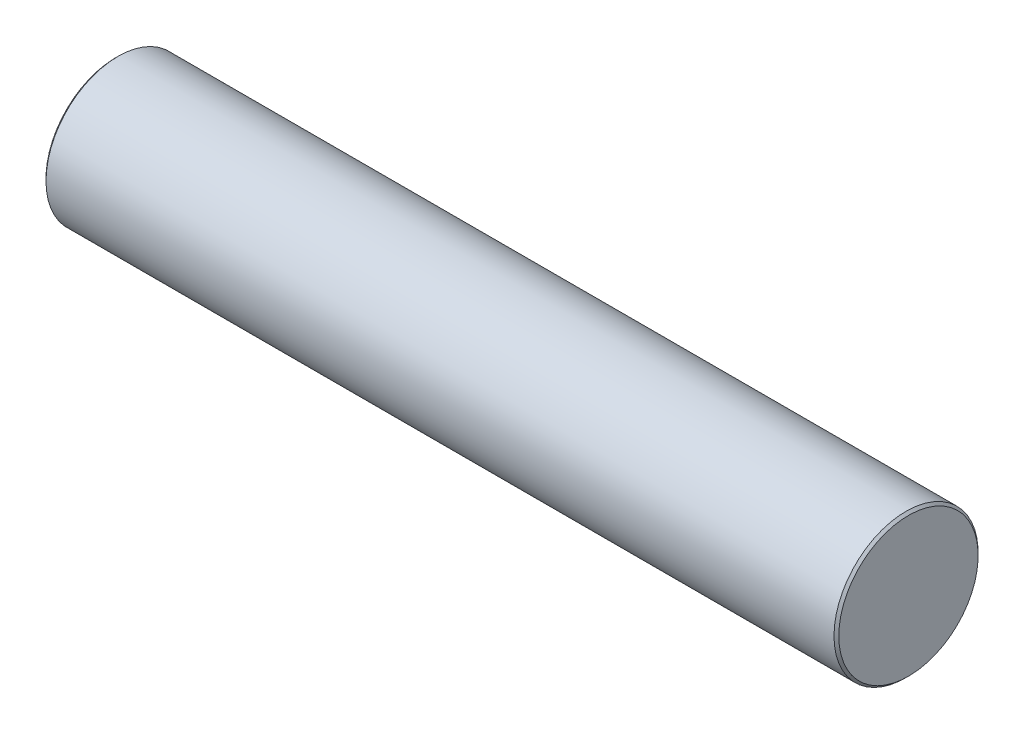
ISO-10303-21;
HEADER;
FILE_DESCRIPTION(('STEP AP214'),'2;1');
FILE_NAME('part.step','',(''),(''),'','','');
FILE_SCHEMA(('AUTOMOTIVE_DESIGN { 1 0 10303 214 1 1 1 1 }'));
ENDSEC;
DATA;
#1=APPLICATION_CONTEXT('core data for automotive mechanical design processes');
#2=APPLICATION_PROTOCOL_DEFINITION('international standard','automotive_design',2000,#1);
#3=PRODUCT_CONTEXT('',#1,'mechanical');
#4=PRODUCT('Part','Part','',(#3));
#5=PRODUCT_RELATED_PRODUCT_CATEGORY('part','',(#4));
#6=PRODUCT_DEFINITION_FORMATION('','',#4);
#7=PRODUCT_DEFINITION_CONTEXT('part definition',#1,'design');
#8=PRODUCT_DEFINITION('design','',#6,#7);
#9=PRODUCT_DEFINITION_SHAPE('','',#8);
#10=(LENGTH_UNIT() NAMED_UNIT(*) SI_UNIT(.MILLI.,.METRE.));
#11=(NAMED_UNIT(*) PLANE_ANGLE_UNIT() SI_UNIT($,.RADIAN.));
#12=(NAMED_UNIT(*) SI_UNIT($,.STERADIAN.) SOLID_ANGLE_UNIT());
#13=UNCERTAINTY_MEASURE_WITH_UNIT(LENGTH_MEASURE(1.E-05),#10,'distance_accuracy_value','');
#14=(GEOMETRIC_REPRESENTATION_CONTEXT(3) GLOBAL_UNCERTAINTY_ASSIGNED_CONTEXT((#13)) GLOBAL_UNIT_ASSIGNED_CONTEXT((#10,
#11,#12)) REPRESENTATION_CONTEXT('',''));
#15=CARTESIAN_POINT('',(0.,0.,0.));
#16=DIRECTION('',(0.,0.,1.));
#17=DIRECTION('',(1.,0.,0.));
#18=AXIS2_PLACEMENT_3D('',#15,#16,#17);
#19=CARTESIAN_POINT('',(165.,0.,0.));
#20=DIRECTION('',(-0.999999999999999,0.,0.));
#21=DIRECTION('',(0.,0.,0.999999999999999));
#22=AXIS2_PLACEMENT_3D('',#19,#20,#21);
#23=CYLINDRICAL_SURFACE('',#22,30.);
#24=CARTESIAN_POINT('',(-164.,0.,2.22044604925031E-13));
#25=DIRECTION('',(0.999999999999999,0.,0.));
#26=DIRECTION('',(0.,0.,-0.999999999999999));
#27=AXIS2_PLACEMENT_3D('',#24,#25,#26);
#28=CIRCLE('',#27,30.);
#29=CARTESIAN_POINT('',(-164.,0.,30.));
#30=VERTEX_POINT('',#29);
#31=EDGE_CURVE('E44',#30,#30,#28,.T.);
#32=CARTESIAN_POINT('',(164.,0.,0.));
#33=DIRECTION('',(0.999999999999999,0.,0.));
#34=DIRECTION('',(0.,0.,-0.999999999999999));
#35=AXIS2_PLACEMENT_3D('',#32,#33,#34);
#36=CIRCLE('',#35,30.);
#37=CARTESIAN_POINT('',(164.,0.,30.));
#38=VERTEX_POINT('',#37);
#39=EDGE_CURVE('E48',#38,#38,#36,.F.);
#40=CARTESIAN_POINT('',(-164.,0.,30.));
#41=CARTESIAN_POINT('',(-160.583333333333,0.,30.));
#42=CARTESIAN_POINT('',(-157.166666666666,0.,30.));
#43=CARTESIAN_POINT('',(-150.333333333333,0.,30.));
#44=CARTESIAN_POINT('',(-146.916666666667,0.,30.));
#45=CARTESIAN_POINT('',(-140.083333333333,0.,30.));
#46=CARTESIAN_POINT('',(-136.666666666666,0.,30.));
#47=CARTESIAN_POINT('',(-129.833333333333,0.,30.));
#48=CARTESIAN_POINT('',(-126.416666666666,0.,30.));
#49=CARTESIAN_POINT('',(-119.583333333333,0.,30.));
#50=CARTESIAN_POINT('',(-116.166666666667,0.,30.));
#51=CARTESIAN_POINT('',(-109.333333333333,0.,30.));
#52=CARTESIAN_POINT('',(-105.916666666667,0.,30.));
#53=CARTESIAN_POINT('',(-99.0833333333332,0.,30.));
#54=CARTESIAN_POINT('',(-95.6666666666666,0.,30.));
#55=CARTESIAN_POINT('',(-88.8333333333332,0.,30.));
#56=CARTESIAN_POINT('',(-85.4166666666666,0.,30.));
#57=CARTESIAN_POINT('',(-78.5833333333333,0.,30.));
#58=CARTESIAN_POINT('',(-75.1666666666666,0.,30.));
#59=CARTESIAN_POINT('',(-68.3333333333333,0.,30.));
#60=CARTESIAN_POINT('',(-64.9166666666666,0.,30.));
#61=CARTESIAN_POINT('',(-58.0833333333333,0.,30.));
#62=CARTESIAN_POINT('',(-54.6666666666666,0.,30.));
#63=CARTESIAN_POINT('',(-47.8333333333333,0.,30.));
#64=CARTESIAN_POINT('',(-44.4166666666666,0.,30.));
#65=CARTESIAN_POINT('',(-37.5833333333333,0.,30.));
#66=CARTESIAN_POINT('',(-34.1666666666667,0.,30.));
#67=CARTESIAN_POINT('',(-27.3333333333333,0.,30.));
#68=CARTESIAN_POINT('',(-23.9166666666667,0.,30.));
#69=CARTESIAN_POINT('',(-17.0833333333333,0.,30.));
#70=CARTESIAN_POINT('',(-13.6666666666667,0.,30.));
#71=CARTESIAN_POINT('',(-6.83333333333335,0.,30.));
#72=CARTESIAN_POINT('',(-3.41666666666669,0.,30.));
#73=CARTESIAN_POINT('',(3.41666666666662,0.,30.));
#74=CARTESIAN_POINT('',(6.83333333333328,0.,30.));
#75=CARTESIAN_POINT('',(13.6666666666666,0.,30.));
#76=CARTESIAN_POINT('',(17.0833333333333,0.,30.));
#77=CARTESIAN_POINT('',(23.9166666666666,0.,30.));
#78=CARTESIAN_POINT('',(27.3333333333333,0.,30.));
#79=CARTESIAN_POINT('',(34.1666666666666,0.,30.));
#80=CARTESIAN_POINT('',(37.5833333333332,0.,30.));
#81=CARTESIAN_POINT('',(44.4166666666666,0.,30.));
#82=CARTESIAN_POINT('',(47.8333333333332,0.,30.));
#83=CARTESIAN_POINT('',(54.6666666666665,0.,30.));
#84=CARTESIAN_POINT('',(58.0833333333332,0.,30.));
#85=CARTESIAN_POINT('',(64.9166666666665,0.,30.));
#86=CARTESIAN_POINT('',(68.3333333333332,0.,30.));
#87=CARTESIAN_POINT('',(75.1666666666665,0.,30.));
#88=CARTESIAN_POINT('',(78.5833333333332,0.,30.));
#89=CARTESIAN_POINT('',(85.4166666666665,0.,30.));
#90=CARTESIAN_POINT('',(88.8333333333332,0.,30.));
#91=CARTESIAN_POINT('',(95.6666666666665,0.,30.));
#92=CARTESIAN_POINT('',(99.0833333333331,0.,30.));
#93=CARTESIAN_POINT('',(105.916666666666,0.,30.));
#94=CARTESIAN_POINT('',(109.333333333333,0.,30.));
#95=CARTESIAN_POINT('',(116.166666666666,0.,30.));
#96=CARTESIAN_POINT('',(119.583333333333,0.,30.));
#97=CARTESIAN_POINT('',(126.416666666666,0.,30.));
#98=CARTESIAN_POINT('',(129.833333333333,0.,30.));
#99=CARTESIAN_POINT('',(136.666666666666,0.,30.));
#100=CARTESIAN_POINT('',(140.083333333333,0.,30.));
#101=CARTESIAN_POINT('',(146.916666666666,0.,30.));
#102=CARTESIAN_POINT('',(150.333333333333,0.,30.));
#103=CARTESIAN_POINT('',(157.166666666666,0.,30.));
#104=CARTESIAN_POINT('',(160.583333333333,0.,30.));
#105=CARTESIAN_POINT('',(164.,0.,30.));
#106=B_SPLINE_CURVE_WITH_KNOTS('',3,(#40,#41,#42,#43,#44,#45,#46,#47,#48,#49,#50,#51,#52,#53,
#54,#55,#56,#57,#58,#59,#60,#61,#62,#63,#64,#65,#66,#67,#68,#69,#70,#71,#72,#73,#74,#75,#76,#77,
#78,#79,#80,#81,#82,#83,#84,#85,#86,#87,#88,#89,#90,#91,#92,#93,#94,#95,#96,#97,#98,#99,#100,
#101,#102,#103,#104,#105),.UNSPECIFIED.,.F.,.F.,(4,2,2,2,2,2,2,2,2,2,2,2,2,2,2,2,2,2,2,2,2,2,2,
2,2,2,2,2,2,2,2,2,4),(0.,10.2499999999999,20.4999999999999,30.7499999999999,40.9999999999999,
51.2499999999999,61.4999999999999,71.7499999999999,81.9999999999999,92.2499999999998,102.5,
112.75,123.,133.25,143.5,153.75,164.,174.25,184.5,194.75,205.,215.25,225.5,235.75,246.,256.25,
266.499999999999,276.75,287.,297.249999999999,307.499999999999,317.749999999999,
327.999999999999),.UNSPECIFIED.);
#107=EDGE_CURVE('BSEAM33',#30,#38,#106,.T.);
#108=ORIENTED_EDGE('',*,*,#31,.T.);
#109=ORIENTED_EDGE('',*,*,#39,.T.);
#110=ORIENTED_EDGE('',*,*,#107,.T.);
#111=ORIENTED_EDGE('',*,*,#107,.F.);
#112=EDGE_LOOP('',(#108,#110,#109,#111));
#113=FACE_BOUND('',#112,.T.);
#114=ADVANCED_FACE('F33',(#113),#23,.T.);
#115=CARTESIAN_POINT('',(165.,0.,0.));
#116=DIRECTION('',(0.999999999999999,0.,0.));
#117=DIRECTION('',(0.,0.,-0.999999999999999));
#118=AXIS2_PLACEMENT_3D('',#115,#116,#117);
#119=PLANE('',#118);
#120=CARTESIAN_POINT('',(165.,0.,0.));
#121=DIRECTION('',(0.999999999999999,0.,0.));
#122=DIRECTION('',(0.,0.,-0.999999999999999));
#123=AXIS2_PLACEMENT_3D('',#120,#121,#122);
#124=CIRCLE('',#123,28.9999999999999);
#125=CARTESIAN_POINT('',(165.,0.,28.9999999999999));
#126=VERTEX_POINT('',#125);
#127=EDGE_CURVE('E10',#126,#126,#124,.T.);
#128=ORIENTED_EDGE('',*,*,#127,.T.);
#129=EDGE_LOOP('',(#128));
#130=FACE_BOUND('',#129,.T.);
#131=ADVANCED_FACE('F64',(#130),#119,.T.);
#132=CARTESIAN_POINT('',(-165.,0.,2.22044604925031E-13));
#133=DIRECTION('',(0.999999999999999,0.,0.));
#134=DIRECTION('',(0.,0.,-0.999999999999999));
#135=AXIS2_PLACEMENT_3D('',#132,#133,#134);
#136=PLANE('',#135);
#137=CARTESIAN_POINT('',(-165.,0.,2.22044604925031E-13));
#138=DIRECTION('',(0.999999999999999,0.,0.));
#139=DIRECTION('',(0.,0.,-0.999999999999999));
#140=AXIS2_PLACEMENT_3D('',#137,#138,#139);
#141=CIRCLE('',#140,29.);
#142=CARTESIAN_POINT('',(-165.,0.,-28.9999999999998));
#143=VERTEX_POINT('',#142);
#144=EDGE_CURVE('E40',#143,#143,#141,.F.);
#145=ORIENTED_EDGE('',*,*,#144,.T.);
#146=EDGE_LOOP('',(#145));
#147=FACE_BOUND('',#146,.T.);
#148=ADVANCED_FACE('F61',(#147),#136,.F.);
#149=CARTESIAN_POINT('',(-164.,0.,2.22044604925031E-13));
#150=DIRECTION('',(0.999999999999999,0.,0.));
#151=DIRECTION('',(0.,0.,-0.999999999999999));
#152=AXIS2_PLACEMENT_3D('',#149,#150,#151);
#153=CONICAL_SURFACE('',#152,30.,0.785398163397464);
#154=ORIENTED_EDGE('',*,*,#144,.F.);
#155=EDGE_LOOP('',(#154));
#156=FACE_BOUND('',#155,.T.);
#157=ORIENTED_EDGE('',*,*,#31,.F.);
#158=EDGE_LOOP('',(#157));
#159=FACE_BOUND('',#158,.T.);
#160=ADVANCED_FACE('F57',(#156,#159),#153,.T.);
#161=CARTESIAN_POINT('',(165.,0.,0.));
#162=DIRECTION('',(-0.999999999999999,0.,0.));
#163=DIRECTION('',(0.,0.,0.999999999999999));
#164=AXIS2_PLACEMENT_3D('',#161,#162,#163);
#165=CONICAL_SURFACE('',#164,28.9999999999999,0.78539816339745);
#166=CARTESIAN_POINT('',(164.,0.,30.));
#167=CARTESIAN_POINT('',(164.010416666666,0.,29.9895833333333));
#168=CARTESIAN_POINT('',(164.020833333333,0.,29.9791666666666));
#169=CARTESIAN_POINT('',(164.041666666666,0.,29.9583333333333));
#170=CARTESIAN_POINT('',(164.052083333333,0.,29.9479166666666));
#171=CARTESIAN_POINT('',(164.072916666666,0.,29.9270833333333));
#172=CARTESIAN_POINT('',(164.083333333333,0.,29.9166666666666));
#173=CARTESIAN_POINT('',(164.104166666666,0.,29.8958333333333));
#174=CARTESIAN_POINT('',(164.114583333333,0.,29.8854166666666));
#175=CARTESIAN_POINT('',(164.135416666666,0.,29.8645833333333));
#176=CARTESIAN_POINT('',(164.145833333333,0.,29.8541666666666));
#177=CARTESIAN_POINT('',(164.166666666666,0.,29.8333333333333));
#178=CARTESIAN_POINT('',(164.177083333333,0.,29.8229166666666));
#179=CARTESIAN_POINT('',(164.197916666666,0.,29.8020833333333));
#180=CARTESIAN_POINT('',(164.208333333333,0.,29.7916666666666));
#181=CARTESIAN_POINT('',(164.229166666666,0.,29.7708333333333));
#182=CARTESIAN_POINT('',(164.239583333333,0.,29.7604166666666));
#183=CARTESIAN_POINT('',(164.260416666666,0.,29.7395833333333));
#184=CARTESIAN_POINT('',(164.270833333333,0.,29.7291666666666));
#185=CARTESIAN_POINT('',(164.291666666666,0.,29.7083333333333));
#186=CARTESIAN_POINT('',(164.302083333333,0.,29.6979166666666));
#187=CARTESIAN_POINT('',(164.322916666666,0.,29.6770833333333));
#188=CARTESIAN_POINT('',(164.333333333333,0.,29.6666666666666));
#189=CARTESIAN_POINT('',(164.354166666666,0.,29.6458333333333));
#190=CARTESIAN_POINT('',(164.364583333333,0.,29.6354166666666));
#191=CARTESIAN_POINT('',(164.385416666666,0.,29.6145833333333));
#192=CARTESIAN_POINT('',(164.395833333333,0.,29.6041666666666));
#193=CARTESIAN_POINT('',(164.416666666666,0.,29.5833333333333));
#194=CARTESIAN_POINT('',(164.427083333333,0.,29.5729166666666));
#195=CARTESIAN_POINT('',(164.447916666666,0.,29.5520833333333));
#196=CARTESIAN_POINT('',(164.458333333333,0.,29.5416666666666));
#197=CARTESIAN_POINT('',(164.479166666666,0.,29.5208333333333));
#198=CARTESIAN_POINT('',(164.489583333333,0.,29.5104166666666));
#199=CARTESIAN_POINT('',(164.510416666666,0.,29.4895833333333));
#200=CARTESIAN_POINT('',(164.520833333333,0.,29.4791666666666));
#201=CARTESIAN_POINT('',(164.541666666666,0.,29.4583333333333));
#202=CARTESIAN_POINT('',(164.552083333333,0.,29.4479166666666));
#203=CARTESIAN_POINT('',(164.572916666666,0.,29.4270833333333));
#204=CARTESIAN_POINT('',(164.583333333333,0.,29.4166666666666));
#205=CARTESIAN_POINT('',(164.604166666666,0.,29.3958333333332));
#206=CARTESIAN_POINT('',(164.614583333333,0.,29.3854166666666));
#207=CARTESIAN_POINT('',(164.635416666666,0.,29.3645833333332));
#208=CARTESIAN_POINT('',(164.645833333333,0.,29.3541666666666));
#209=CARTESIAN_POINT('',(164.666666666666,0.,29.3333333333332));
#210=CARTESIAN_POINT('',(164.677083333333,0.,29.3229166666666));
#211=CARTESIAN_POINT('',(164.697916666666,0.,29.3020833333332));
#212=CARTESIAN_POINT('',(164.708333333333,0.,29.2916666666666));
#213=CARTESIAN_POINT('',(164.729166666666,0.,29.2708333333332));
#214=CARTESIAN_POINT('',(164.739583333333,0.,29.2604166666666));
#215=CARTESIAN_POINT('',(164.760416666666,0.,29.2395833333332));
#216=CARTESIAN_POINT('',(164.770833333333,0.,29.2291666666666));
#217=CARTESIAN_POINT('',(164.791666666666,0.,29.2083333333332));
#218=CARTESIAN_POINT('',(164.802083333333,0.,29.1979166666666));
#219=CARTESIAN_POINT('',(164.822916666666,0.,29.1770833333332));
#220=CARTESIAN_POINT('',(164.833333333333,0.,29.1666666666666));
#221=CARTESIAN_POINT('',(164.854166666666,0.,29.1458333333332));
#222=CARTESIAN_POINT('',(164.864583333333,0.,29.1354166666666));
#223=CARTESIAN_POINT('',(164.885416666666,0.,29.1145833333332));
#224=CARTESIAN_POINT('',(164.895833333333,0.,29.1041666666665));
#225=CARTESIAN_POINT('',(164.916666666666,0.,29.0833333333332));
#226=CARTESIAN_POINT('',(164.927083333333,0.,29.0729166666665));
#227=CARTESIAN_POINT('',(164.947916666666,0.,29.0520833333332));
#228=CARTESIAN_POINT('',(164.958333333333,0.,29.0416666666665));
#229=CARTESIAN_POINT('',(164.979166666666,0.,29.0208333333332));
#230=CARTESIAN_POINT('',(164.989583333333,0.,29.0104166666665));
#231=CARTESIAN_POINT('',(165.,0.,28.9999999999999));
#232=B_SPLINE_CURVE_WITH_KNOTS('',3,(#166,#167,#168,#169,#170,#171,#172,#173,#174,#175,#176,
#177,#178,#179,#180,#181,#182,#183,#184,#185,#186,#187,#188,#189,#190,#191,#192,#193,#194,#195,
#196,#197,#198,#199,#200,#201,#202,#203,#204,#205,#206,#207,#208,#209,#210,#211,#212,#213,#214,
#215,#216,#217,#218,#219,#220,#221,#222,#223,#224,#225,#226,#227,#228,#229,#230,#231),
.UNSPECIFIED.,.F.,.F.,(4,2,2,2,2,2,2,2,2,2,2,2,2,2,2,2,2,2,2,2,2,2,2,2,2,2,2,2,2,2,2,2,4),(0.,
0.0441941738241494,0.0883883476483185,0.132582521472488,0.176776695296657,0.220970869120806,
0.265165042944975,0.309359216769144,0.353553390593313,0.397747564417463,0.441941738241629,
0.486135912065798,0.530330085889968,0.574524259714117,0.618718433538286,0.662912607362455,
0.707106781186624,0.751300955010773,0.795495128834943,0.839689302659112,0.883883476483283,
0.928077650307433,0.972271824131602,1.01646599795577,1.06066017177994,1.10485434560409,
1.14904851942826,1.19324269325243,1.2374368670766,1.28163104090075,1.32582521472491,
1.37001938854908,1.41421356237323),.UNSPECIFIED.);
#233=EDGE_CURVE('BSEAM35',#38,#126,#232,.T.);
#234=ORIENTED_EDGE('',*,*,#39,.F.);
#235=ORIENTED_EDGE('',*,*,#127,.F.);
#236=ORIENTED_EDGE('',*,*,#233,.T.);
#237=ORIENTED_EDGE('',*,*,#233,.F.);
#238=EDGE_LOOP('',(#234,#236,#235,#237));
#239=FACE_BOUND('',#238,.T.);
#240=ADVANCED_FACE('F35',(#239),#165,.T.);
#241=CLOSED_SHELL('',(#114,#131,#148,#160,#240));
#242=MANIFOLD_SOLID_BREP('B2',#241);
#243=ADVANCED_BREP_SHAPE_REPRESENTATION('',(#18,#242),#14);
#244=SHAPE_DEFINITION_REPRESENTATION(#9,#243);
ENDSEC;
END-ISO-10303-21;
